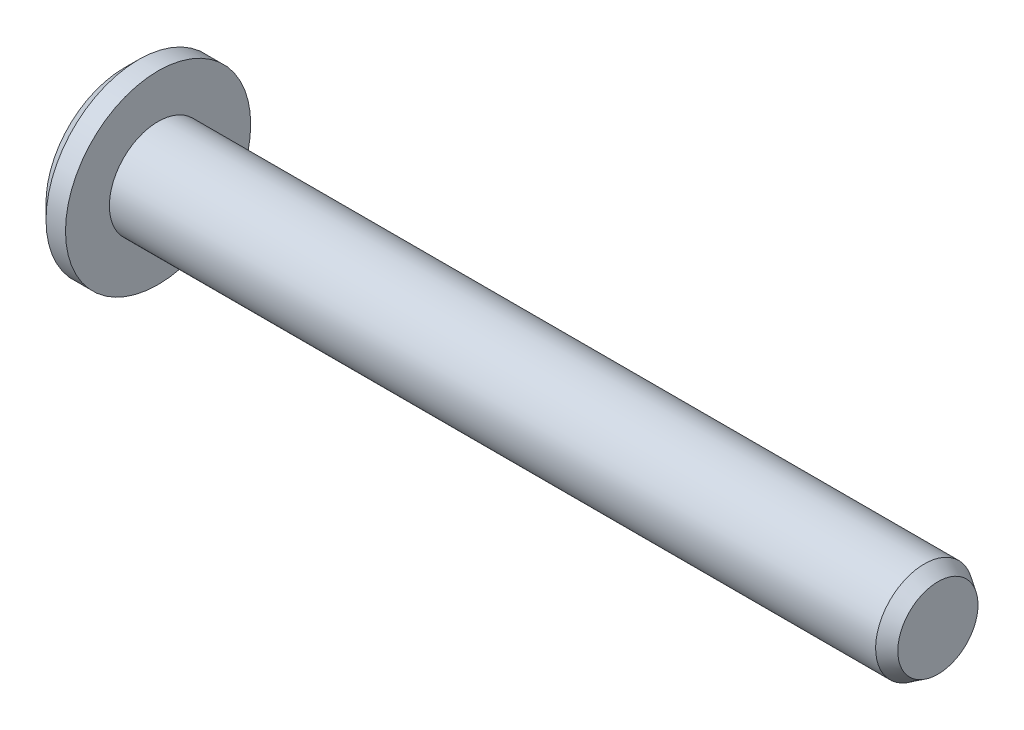
ISO-10303-21;
HEADER;
FILE_DESCRIPTION(('STEP AP214'),'2;1');
FILE_NAME('part.step','',(''),(''),'','','');
FILE_SCHEMA(('AUTOMOTIVE_DESIGN { 1 0 10303 214 1 1 1 1 }'));
ENDSEC;
DATA;
#1=APPLICATION_CONTEXT('core data for automotive mechanical design processes');
#2=APPLICATION_PROTOCOL_DEFINITION('international standard','automotive_design',2000,#1);
#3=PRODUCT_CONTEXT('',#1,'mechanical');
#4=PRODUCT('Part','Part','',(#3));
#5=PRODUCT_RELATED_PRODUCT_CATEGORY('part','',(#4));
#6=PRODUCT_DEFINITION_FORMATION('','',#4);
#7=PRODUCT_DEFINITION_CONTEXT('part definition',#1,'design');
#8=PRODUCT_DEFINITION('design','',#6,#7);
#9=PRODUCT_DEFINITION_SHAPE('','',#8);
#10=(LENGTH_UNIT() NAMED_UNIT(*) SI_UNIT(.MILLI.,.METRE.));
#11=(NAMED_UNIT(*) PLANE_ANGLE_UNIT() SI_UNIT($,.RADIAN.));
#12=(NAMED_UNIT(*) SI_UNIT($,.STERADIAN.) SOLID_ANGLE_UNIT());
#13=UNCERTAINTY_MEASURE_WITH_UNIT(LENGTH_MEASURE(1.E-05),#10,'distance_accuracy_value','');
#14=(GEOMETRIC_REPRESENTATION_CONTEXT(3) GLOBAL_UNCERTAINTY_ASSIGNED_CONTEXT((#13)) GLOBAL_UNIT_ASSIGNED_CONTEXT((#10,
#11,#12)) REPRESENTATION_CONTEXT('',''));
#15=CARTESIAN_POINT('',(0.,0.,0.));
#16=DIRECTION('',(0.,0.,1.));
#17=DIRECTION('',(1.,0.,0.));
#18=AXIS2_PLACEMENT_3D('',#15,#16,#17);
#19=CARTESIAN_POINT('',(41.75,0.,0.));
#20=DIRECTION('',(-1.,0.,0.));
#21=DIRECTION('',(0.,-1.,0.));
#22=AXIS2_PLACEMENT_3D('',#19,#20,#21);
#23=PLANE('',#22);
#24=CARTESIAN_POINT('',(41.75,0.,0.));
#25=DIRECTION('',(-1.,0.,0.));
#26=DIRECTION('',(0.,-1.,0.));
#27=AXIS2_PLACEMENT_3D('',#24,#25,#26);
#28=CIRCLE('',#27,2.05723616873881);
#29=CARTESIAN_POINT('',(41.75,-2.05723616873882,0.));
#30=VERTEX_POINT('',#29);
#31=EDGE_CURVE('E149',#30,#30,#28,.T.);
#32=ORIENTED_EDGE('',*,*,#31,.F.);
#33=EDGE_LOOP('',(#32));
#34=FACE_BOUND('',#33,.T.);
#35=ADVANCED_FACE('F33',(#34),#23,.F.);
#36=CARTESIAN_POINT('',(41.75,0.,0.));
#37=DIRECTION('',(-1.,0.,0.));
#38=DIRECTION('',(0.,-1.,0.));
#39=AXIS2_PLACEMENT_3D('',#36,#37,#38);
#40=CONICAL_SURFACE('',#39,2.05723616873881,0.567232006898155);
#41=CARTESIAN_POINT('',(41.055,0.,0.));
#42=DIRECTION('',(-1.,0.,0.));
#43=DIRECTION('',(0.,-1.,0.));
#44=AXIS2_PLACEMENT_3D('',#41,#42,#43);
#45=CIRCLE('',#44,2.50000000000003);
#46=CARTESIAN_POINT('',(41.055,-2.50000000000004,0.));
#47=VERTEX_POINT('',#46);
#48=EDGE_CURVE('E146',#47,#47,#45,.T.);
#49=ORIENTED_EDGE('',*,*,#48,.F.);
#50=EDGE_LOOP('',(#49));
#51=FACE_BOUND('',#50,.T.);
#52=ORIENTED_EDGE('',*,*,#31,.T.);
#53=EDGE_LOOP('',(#52));
#54=FACE_BOUND('',#53,.T.);
#55=ADVANCED_FACE('F166',(#51,#54),#40,.T.);
#56=CARTESIAN_POINT('',(0.,0.,0.));
#57=DIRECTION('',(-1.,0.,0.));
#58=DIRECTION('',(0.,-1.,0.));
#59=AXIS2_PLACEMENT_3D('',#56,#57,#58);
#60=CYLINDRICAL_SURFACE('',#59,2.50000000000002);
#61=CARTESIAN_POINT('',(1.75,0.,0.));
#62=DIRECTION('',(-1.,0.,0.));
#63=DIRECTION('',(0.,-1.,0.));
#64=AXIS2_PLACEMENT_3D('',#61,#62,#63);
#65=CIRCLE('',#64,2.50000000000002);
#66=CARTESIAN_POINT('',(1.75,-2.50000000000002,0.));
#67=VERTEX_POINT('',#66);
#68=EDGE_CURVE('E143',#67,#67,#65,.T.);
#69=ORIENTED_EDGE('',*,*,#68,.F.);
#70=EDGE_LOOP('',(#69));
#71=FACE_BOUND('',#70,.T.);
#72=ORIENTED_EDGE('',*,*,#48,.T.);
#73=EDGE_LOOP('',(#72));
#74=FACE_BOUND('',#73,.T.);
#75=ADVANCED_FACE('F171',(#71,#74),#60,.T.);
#76=CARTESIAN_POINT('',(1.75,2.50000000000002,0.));
#77=DIRECTION('',(-1.,0.,0.));
#78=DIRECTION('',(0.,-1.,0.));
#79=AXIS2_PLACEMENT_3D('',#76,#77,#78);
#80=PLANE('',#79);
#81=CARTESIAN_POINT('',(1.75,0.,0.));
#82=DIRECTION('',(-1.,0.,0.));
#83=DIRECTION('',(0.,-1.,0.));
#84=AXIS2_PLACEMENT_3D('',#81,#82,#83);
#85=CIRCLE('',#84,4.75000000000001);
#86=CARTESIAN_POINT('',(1.75,-4.75000000000001,0.));
#87=VERTEX_POINT('',#86);
#88=EDGE_CURVE('E135',#87,#87,#85,.T.);
#89=ORIENTED_EDGE('',*,*,#88,.F.);
#90=EDGE_LOOP('',(#89));
#91=FACE_BOUND('',#90,.T.);
#92=ORIENTED_EDGE('',*,*,#68,.T.);
#93=EDGE_LOOP('',(#92));
#94=FACE_BOUND('',#93,.T.);
#95=ADVANCED_FACE('F178',(#91,#94),#80,.F.);
#96=CARTESIAN_POINT('',(0.,0.,0.));
#97=DIRECTION('',(-1.,0.,0.));
#98=DIRECTION('',(0.,-1.,0.));
#99=AXIS2_PLACEMENT_3D('',#96,#97,#98);
#100=CYLINDRICAL_SURFACE('',#99,4.75000000000001);
#101=CARTESIAN_POINT('',(0.749999999999998,0.,0.));
#102=DIRECTION('',(1.,0.,0.));
#103=DIRECTION('',(0.,1.,0.));
#104=AXIS2_PLACEMENT_3D('',#101,#102,#103);
#105=CIRCLE('',#104,4.75000000000001);
#106=CARTESIAN_POINT('',(0.749999999999999,4.75000000000001,0.));
#107=VERTEX_POINT('',#106);
#108=EDGE_CURVE('E11',#107,#107,#105,.T.);
#109=ORIENTED_EDGE('',*,*,#108,.T.);
#110=EDGE_LOOP('',(#109));
#111=FACE_BOUND('',#110,.T.);
#112=ORIENTED_EDGE('',*,*,#88,.T.);
#113=EDGE_LOOP('',(#112));
#114=FACE_BOUND('',#113,.T.);
#115=ADVANCED_FACE('F182',(#111,#114),#100,.T.);
#116=CARTESIAN_POINT('',(0.,4.75000000000001,0.));
#117=DIRECTION('',(1.,0.,0.));
#118=DIRECTION('',(0.,1.,0.));
#119=AXIS2_PLACEMENT_3D('',#116,#117,#118);
#120=PLANE('',#119);
#121=CARTESIAN_POINT('',(0.,0.,0.));
#122=DIRECTION('',(1.,0.,0.));
#123=DIRECTION('',(0.,1.,0.));
#124=AXIS2_PLACEMENT_3D('',#121,#122,#123);
#125=CIRCLE('',#124,4.00000000000002);
#126=CARTESIAN_POINT('',(0.,4.00000000000002,0.));
#127=VERTEX_POINT('',#126);
#128=EDGE_CURVE('E41',#127,#127,#125,.F.);
#129=ORIENTED_EDGE('',*,*,#128,.T.);
#130=EDGE_LOOP('',(#129));
#131=FACE_BOUND('',#130,.T.);
#132=DIRECTION('',(0.,1.,0.));
#133=VECTOR('',#132,1.);
#134=CARTESIAN_POINT('',(0.,-0.866025403784439,1.5));
#135=LINE('',#134,#133);
#136=CARTESIAN_POINT('',(0.,-0.86602540378444,1.5));
#137=VERTEX_POINT('',#136);
#138=CARTESIAN_POINT('',(0.,0.86602540378444,1.5));
#139=VERTEX_POINT('',#138);
#140=EDGE_CURVE('E122',#137,#139,#135,.T.);
#141=ORIENTED_EDGE('',*,*,#140,.F.);
#142=DIRECTION('',(0.,0.5,0.866025403784439));
#143=VECTOR('',#142,1.);
#144=CARTESIAN_POINT('',(0.,-1.73205080756888,0.));
#145=LINE('',#144,#143);
#146=CARTESIAN_POINT('',(0.,-1.73205080756888,0.));
#147=VERTEX_POINT('',#146);
#148=EDGE_CURVE('E48',#147,#137,#145,.T.);
#149=ORIENTED_EDGE('',*,*,#148,.F.);
#150=DIRECTION('',(0.,-0.5,0.866025403784439));
#151=VECTOR('',#150,1.);
#152=CARTESIAN_POINT('',(0.,-0.866025403784439,-1.5));
#153=LINE('',#152,#151);
#154=CARTESIAN_POINT('',(0.,-0.866025403784439,-1.5));
#155=VERTEX_POINT('',#154);
#156=EDGE_CURVE('E131',#155,#147,#153,.T.);
#157=ORIENTED_EDGE('',*,*,#156,.F.);
#158=DIRECTION('',(0.,-1.,0.));
#159=VECTOR('',#158,1.);
#160=CARTESIAN_POINT('',(0.,0.86602540378444,-1.5));
#161=LINE('',#160,#159);
#162=CARTESIAN_POINT('',(0.,0.86602540378444,-1.5));
#163=VERTEX_POINT('',#162);
#164=EDGE_CURVE('E129',#163,#155,#161,.T.);
#165=ORIENTED_EDGE('',*,*,#164,.F.);
#166=DIRECTION('',(0.,-0.5,-0.866025403784439));
#167=VECTOR('',#166,1.);
#168=CARTESIAN_POINT('',(0.,1.73205080756888,0.));
#169=LINE('',#168,#167);
#170=CARTESIAN_POINT('',(0.,1.73205080756888,0.));
#171=VERTEX_POINT('',#170);
#172=EDGE_CURVE('E96',#171,#163,#169,.T.);
#173=ORIENTED_EDGE('',*,*,#172,.F.);
#174=DIRECTION('',(0.,0.5,-0.866025403784439));
#175=VECTOR('',#174,1.);
#176=CARTESIAN_POINT('',(0.,0.86602540378444,1.5));
#177=LINE('',#176,#175);
#178=EDGE_CURVE('E125',#139,#171,#177,.T.);
#179=ORIENTED_EDGE('',*,*,#178,.F.);
#180=EDGE_LOOP('',(#141,#149,#157,#165,#173,#179));
#181=FACE_BOUND('',#180,.T.);
#182=ADVANCED_FACE('F154',(#131,#181),#120,.F.);
#183=CARTESIAN_POINT('',(1.,-1.73205080756888,0.));
#184=DIRECTION('',(0.,-0.866025403784439,0.5));
#185=DIRECTION('',(0.,-0.5,-0.866025403784439));
#186=AXIS2_PLACEMENT_3D('',#183,#184,#185);
#187=PLANE('',#186);
#188=ORIENTED_EDGE('',*,*,#148,.T.);
#189=DIRECTION('',(-1.,0.,0.));
#190=VECTOR('',#189,1.);
#191=CARTESIAN_POINT('',(1.,-0.866025403784439,1.5));
#192=LINE('',#191,#190);
#193=CARTESIAN_POINT('',(1.,-0.866025403784439,1.5));
#194=VERTEX_POINT('',#193);
#195=EDGE_CURVE('E78',#194,#137,#192,.T.);
#196=ORIENTED_EDGE('',*,*,#195,.F.);
#197=DIRECTION('',(0.,0.5,0.866025403784439));
#198=VECTOR('',#197,1.);
#199=CARTESIAN_POINT('',(1.,-1.73205080756888,0.));
#200=LINE('',#199,#198);
#201=CARTESIAN_POINT('',(1.,-1.73205080756888,0.));
#202=VERTEX_POINT('',#201);
#203=EDGE_CURVE('E133',#202,#194,#200,.T.);
#204=ORIENTED_EDGE('',*,*,#203,.F.);
#205=DIRECTION('',(-1.,0.,0.));
#206=VECTOR('',#205,1.);
#207=CARTESIAN_POINT('',(1.,-1.73205080756888,0.));
#208=LINE('',#207,#206);
#209=EDGE_CURVE('E56',#202,#147,#208,.T.);
#210=ORIENTED_EDGE('',*,*,#209,.T.);
#211=EDGE_LOOP('',(#188,#196,#204,#210));
#212=FACE_BOUND('',#211,.T.);
#213=ADVANCED_FACE('F189',(#212),#187,.F.);
#214=CARTESIAN_POINT('',(1.,-0.866025403784439,-1.5));
#215=DIRECTION('',(0.,-0.866025403784439,-0.5));
#216=DIRECTION('',(0.,0.5,-0.866025403784439));
#217=AXIS2_PLACEMENT_3D('',#214,#215,#216);
#218=PLANE('',#217);
#219=ORIENTED_EDGE('',*,*,#156,.T.);
#220=ORIENTED_EDGE('',*,*,#209,.F.);
#221=DIRECTION('',(0.,-0.5,0.866025403784439));
#222=VECTOR('',#221,1.);
#223=CARTESIAN_POINT('',(1.,-0.866025403784439,-1.5));
#224=LINE('',#223,#222);
#225=CARTESIAN_POINT('',(1.,-0.866025403784439,-1.5));
#226=VERTEX_POINT('',#225);
#227=EDGE_CURVE('E108',#226,#202,#224,.T.);
#228=ORIENTED_EDGE('',*,*,#227,.F.);
#229=DIRECTION('',(-1.,0.,0.));
#230=VECTOR('',#229,1.);
#231=CARTESIAN_POINT('',(1.,-0.866025403784439,-1.5));
#232=LINE('',#231,#230);
#233=EDGE_CURVE('E100',#226,#155,#232,.T.);
#234=ORIENTED_EDGE('',*,*,#233,.T.);
#235=EDGE_LOOP('',(#219,#220,#228,#234));
#236=FACE_BOUND('',#235,.T.);
#237=ADVANCED_FACE('F192',(#236),#218,.F.);
#238=CARTESIAN_POINT('',(1.,0.86602540378444,-1.5));
#239=DIRECTION('',(0.,0.,-1.));
#240=DIRECTION('',(0.,1.,0.));
#241=AXIS2_PLACEMENT_3D('',#238,#239,#240);
#242=PLANE('',#241);
#243=ORIENTED_EDGE('',*,*,#164,.T.);
#244=ORIENTED_EDGE('',*,*,#233,.F.);
#245=DIRECTION('',(0.,-1.,0.));
#246=VECTOR('',#245,1.);
#247=CARTESIAN_POINT('',(1.,0.86602540378444,-1.5));
#248=LINE('',#247,#246);
#249=CARTESIAN_POINT('',(1.,0.86602540378444,-1.5));
#250=VERTEX_POINT('',#249);
#251=EDGE_CURVE('E104',#250,#226,#248,.T.);
#252=ORIENTED_EDGE('',*,*,#251,.F.);
#253=DIRECTION('',(-1.,0.,0.));
#254=VECTOR('',#253,1.);
#255=CARTESIAN_POINT('',(1.,0.86602540378444,-1.5));
#256=LINE('',#255,#254);
#257=EDGE_CURVE('E89',#250,#163,#256,.T.);
#258=ORIENTED_EDGE('',*,*,#257,.T.);
#259=EDGE_LOOP('',(#243,#244,#252,#258));
#260=FACE_BOUND('',#259,.T.);
#261=ADVANCED_FACE('F105',(#260),#242,.F.);
#262=CARTESIAN_POINT('',(1.,1.73205080756888,0.));
#263=DIRECTION('',(0.,0.866025403784439,-0.5));
#264=DIRECTION('',(0.,0.5,0.866025403784439));
#265=AXIS2_PLACEMENT_3D('',#262,#263,#264);
#266=PLANE('',#265);
#267=ORIENTED_EDGE('',*,*,#172,.T.);
#268=ORIENTED_EDGE('',*,*,#257,.F.);
#269=DIRECTION('',(0.,-0.5,-0.866025403784439));
#270=VECTOR('',#269,1.);
#271=CARTESIAN_POINT('',(1.,1.73205080756888,0.));
#272=LINE('',#271,#270);
#273=CARTESIAN_POINT('',(1.,1.73205080756888,0.));
#274=VERTEX_POINT('',#273);
#275=EDGE_CURVE('E93',#274,#250,#272,.T.);
#276=ORIENTED_EDGE('',*,*,#275,.F.);
#277=DIRECTION('',(-1.,0.,0.));
#278=VECTOR('',#277,1.);
#279=CARTESIAN_POINT('',(1.,1.73205080756888,0.));
#280=LINE('',#279,#278);
#281=EDGE_CURVE('E101',#274,#171,#280,.T.);
#282=ORIENTED_EDGE('',*,*,#281,.T.);
#283=EDGE_LOOP('',(#267,#268,#276,#282));
#284=FACE_BOUND('',#283,.T.);
#285=ADVANCED_FACE('F91',(#284),#266,.F.);
#286=CARTESIAN_POINT('',(1.,0.86602540378444,1.5));
#287=DIRECTION('',(0.,0.866025403784439,0.5));
#288=DIRECTION('',(0.,-0.5,0.866025403784439));
#289=AXIS2_PLACEMENT_3D('',#286,#287,#288);
#290=PLANE('',#289);
#291=ORIENTED_EDGE('',*,*,#178,.T.);
#292=ORIENTED_EDGE('',*,*,#281,.F.);
#293=DIRECTION('',(0.,0.5,-0.866025403784439));
#294=VECTOR('',#293,1.);
#295=CARTESIAN_POINT('',(1.,0.86602540378444,1.5));
#296=LINE('',#295,#294);
#297=CARTESIAN_POINT('',(1.,0.86602540378444,1.5));
#298=VERTEX_POINT('',#297);
#299=EDGE_CURVE('E114',#298,#274,#296,.T.);
#300=ORIENTED_EDGE('',*,*,#299,.F.);
#301=DIRECTION('',(-1.,0.,0.));
#302=VECTOR('',#301,1.);
#303=CARTESIAN_POINT('',(1.,0.86602540378444,1.5));
#304=LINE('',#303,#302);
#305=EDGE_CURVE('E138',#298,#139,#304,.T.);
#306=ORIENTED_EDGE('',*,*,#305,.T.);
#307=EDGE_LOOP('',(#291,#292,#300,#306));
#308=FACE_BOUND('',#307,.T.);
#309=ADVANCED_FACE('F195',(#308),#290,.F.);
#310=CARTESIAN_POINT('',(1.,-0.866025403784439,1.5));
#311=DIRECTION('',(0.,0.,1.));
#312=DIRECTION('',(0.,-1.,0.));
#313=AXIS2_PLACEMENT_3D('',#310,#311,#312);
#314=PLANE('',#313);
#315=ORIENTED_EDGE('',*,*,#140,.T.);
#316=ORIENTED_EDGE('',*,*,#305,.F.);
#317=DIRECTION('',(0.,1.,0.));
#318=VECTOR('',#317,1.);
#319=CARTESIAN_POINT('',(1.,-0.866025403784439,1.5));
#320=LINE('',#319,#318);
#321=EDGE_CURVE('E116',#194,#298,#320,.T.);
#322=ORIENTED_EDGE('',*,*,#321,.F.);
#323=ORIENTED_EDGE('',*,*,#195,.T.);
#324=EDGE_LOOP('',(#315,#316,#322,#323));
#325=FACE_BOUND('',#324,.T.);
#326=ADVANCED_FACE('F162',(#325),#314,.F.);
#327=CARTESIAN_POINT('',(1.,0.,0.));
#328=DIRECTION('',(-1.,0.,0.));
#329=DIRECTION('',(0.,-1.,0.));
#330=AXIS2_PLACEMENT_3D('',#327,#328,#329);
#331=PLANE('',#330);
#332=ORIENTED_EDGE('',*,*,#203,.T.);
#333=ORIENTED_EDGE('',*,*,#321,.T.);
#334=ORIENTED_EDGE('',*,*,#299,.T.);
#335=ORIENTED_EDGE('',*,*,#275,.T.);
#336=ORIENTED_EDGE('',*,*,#251,.T.);
#337=ORIENTED_EDGE('',*,*,#227,.T.);
#338=EDGE_LOOP('',(#332,#333,#334,#335,#336,#337));
#339=FACE_BOUND('',#338,.T.);
#340=ADVANCED_FACE('F111',(#339),#331,.T.);
#341=CARTESIAN_POINT('',(0.,0.,0.));
#342=DIRECTION('',(1.,0.,0.));
#343=DIRECTION('',(0.,1.,0.));
#344=AXIS2_PLACEMENT_3D('',#341,#342,#343);
#345=CONICAL_SURFACE('',#344,4.00000000000002,0.785398163397442);
#346=ORIENTED_EDGE('',*,*,#108,.F.);
#347=EDGE_LOOP('',(#346));
#348=FACE_BOUND('',#347,.T.);
#349=ORIENTED_EDGE('',*,*,#128,.F.);
#350=EDGE_LOOP('',(#349));
#351=FACE_BOUND('',#350,.T.);
#352=ADVANCED_FACE('F35',(#348,#351),#345,.T.);
#353=CLOSED_SHELL('',(#35,#55,#75,#95,#115,#182,#213,#237,#261,#285,#309,#326,#340,#352));
#354=MANIFOLD_SOLID_BREP('B2',#353);
#355=ADVANCED_BREP_SHAPE_REPRESENTATION('',(#18,#354),#14);
#356=SHAPE_DEFINITION_REPRESENTATION(#9,#355);
ENDSEC;
END-ISO-10303-21;
